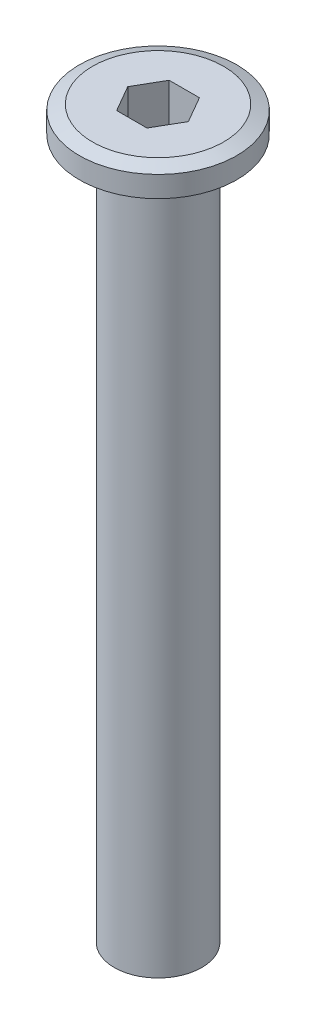
ISO-10303-21;
HEADER;
FILE_DESCRIPTION(('STEP AP214'),'2;1');
FILE_NAME('part.step','',(''),(''),'','','');
FILE_SCHEMA(('AUTOMOTIVE_DESIGN { 1 0 10303 214 1 1 1 1 }'));
ENDSEC;
DATA;
#1=APPLICATION_CONTEXT('core data for automotive mechanical design processes');
#2=APPLICATION_PROTOCOL_DEFINITION('international standard','automotive_design',2000,#1);
#3=PRODUCT_CONTEXT('',#1,'mechanical');
#4=PRODUCT('Part','Part','',(#3));
#5=PRODUCT_RELATED_PRODUCT_CATEGORY('part','',(#4));
#6=PRODUCT_DEFINITION_FORMATION('','',#4);
#7=PRODUCT_DEFINITION_CONTEXT('part definition',#1,'design');
#8=PRODUCT_DEFINITION('design','',#6,#7);
#9=PRODUCT_DEFINITION_SHAPE('','',#8);
#10=(LENGTH_UNIT() NAMED_UNIT(*) SI_UNIT(.MILLI.,.METRE.));
#11=(NAMED_UNIT(*) PLANE_ANGLE_UNIT() SI_UNIT($,.RADIAN.));
#12=(NAMED_UNIT(*) SI_UNIT($,.STERADIAN.) SOLID_ANGLE_UNIT());
#13=UNCERTAINTY_MEASURE_WITH_UNIT(LENGTH_MEASURE(1.E-05),#10,'distance_accuracy_value','');
#14=(GEOMETRIC_REPRESENTATION_CONTEXT(3) GLOBAL_UNCERTAINTY_ASSIGNED_CONTEXT((#13)) GLOBAL_UNIT_ASSIGNED_CONTEXT((#10,
#11,#12)) REPRESENTATION_CONTEXT('',''));
#15=CARTESIAN_POINT('',(0.,0.,0.));
#16=DIRECTION('',(0.,0.,1.));
#17=DIRECTION('',(1.,0.,0.));
#18=AXIS2_PLACEMENT_3D('',#15,#16,#17);
#19=CARTESIAN_POINT('',(0.,1.2,0.));
#20=DIRECTION('',(0.,-1.,0.));
#21=DIRECTION('',(0.,0.,-1.));
#22=AXIS2_PLACEMENT_3D('',#19,#20,#21);
#23=CONICAL_SURFACE('',#22,4.5,1.19028994968253);
#24=CARTESIAN_POINT('',(0.,1.5,0.));
#25=DIRECTION('',(0.,-1.,0.));
#26=DIRECTION('',(0.,0.,-1.));
#27=AXIS2_PLACEMENT_3D('',#24,#25,#26);
#28=CIRCLE('',#27,3.75);
#29=CARTESIAN_POINT('',(0.,1.5,-3.75));
#30=VERTEX_POINT('',#29);
#31=EDGE_CURVE('E146',#30,#30,#28,.T.);
#32=ORIENTED_EDGE('',*,*,#31,.T.);
#33=EDGE_LOOP('',(#32));
#34=FACE_BOUND('',#33,.T.);
#35=CARTESIAN_POINT('',(0.,1.2,0.));
#36=DIRECTION('',(0.,-1.,0.));
#37=DIRECTION('',(0.,0.,-1.));
#38=AXIS2_PLACEMENT_3D('',#35,#36,#37);
#39=CIRCLE('',#38,4.5);
#40=CARTESIAN_POINT('',(0.,1.2,-4.5));
#41=VERTEX_POINT('',#40);
#42=EDGE_CURVE('E44',#41,#41,#39,.T.);
#43=ORIENTED_EDGE('',*,*,#42,.F.);
#44=EDGE_LOOP('',(#43));
#45=FACE_BOUND('',#44,.T.);
#46=ADVANCED_FACE('F37',(#34,#45),#23,.T.);
#47=CARTESIAN_POINT('',(0.,0.,0.));
#48=DIRECTION('',(0.,-1.,0.));
#49=DIRECTION('',(0.,0.,-1.));
#50=AXIS2_PLACEMENT_3D('',#47,#48,#49);
#51=CYLINDRICAL_SURFACE('',#50,4.5);
#52=ORIENTED_EDGE('',*,*,#42,.T.);
#53=EDGE_LOOP('',(#52));
#54=FACE_BOUND('',#53,.T.);
#55=CARTESIAN_POINT('',(0.,0.,0.));
#56=DIRECTION('',(0.,-1.,0.));
#57=DIRECTION('',(0.,0.,-1.));
#58=AXIS2_PLACEMENT_3D('',#55,#56,#57);
#59=CIRCLE('',#58,4.5);
#60=CARTESIAN_POINT('',(0.,0.,-4.5));
#61=VERTEX_POINT('',#60);
#62=EDGE_CURVE('E149',#61,#61,#59,.T.);
#63=ORIENTED_EDGE('',*,*,#62,.F.);
#64=EDGE_LOOP('',(#63));
#65=FACE_BOUND('',#64,.T.);
#66=ADVANCED_FACE('F154',(#54,#65),#51,.T.);
#67=CARTESIAN_POINT('',(0.,0.,0.));
#68=DIRECTION('',(0.,1.,0.));
#69=DIRECTION('',(0.,0.,1.));
#70=AXIS2_PLACEMENT_3D('',#67,#68,#69);
#71=PLANE('',#70);
#72=CARTESIAN_POINT('',(0.,0.,0.));
#73=DIRECTION('',(0.,1.,0.));
#74=DIRECTION('',(0.,0.,1.));
#75=AXIS2_PLACEMENT_3D('',#72,#73,#74);
#76=CIRCLE('',#75,2.5);
#77=CARTESIAN_POINT('',(0.,0.,2.5));
#78=VERTEX_POINT('',#77);
#79=EDGE_CURVE('E11',#78,#78,#76,.F.);
#80=ORIENTED_EDGE('',*,*,#79,.F.);
#81=EDGE_LOOP('',(#80));
#82=FACE_BOUND('',#81,.T.);
#83=ORIENTED_EDGE('',*,*,#62,.T.);
#84=EDGE_LOOP('',(#83));
#85=FACE_BOUND('',#84,.T.);
#86=ADVANCED_FACE('F162',(#82,#85),#71,.F.);
#87=CARTESIAN_POINT('',(0.,1.5,0.));
#88=DIRECTION('',(0.,1.,0.));
#89=DIRECTION('',(0.,0.,1.));
#90=AXIS2_PLACEMENT_3D('',#87,#88,#89);
#91=PLANE('',#90);
#92=DIRECTION('',(0.5,0.,-0.866025403784439));
#93=VECTOR('',#92,1.);
#94=CARTESIAN_POINT('',(0.866025403784439,1.5,1.5));
#95=LINE('',#94,#93);
#96=CARTESIAN_POINT('',(0.866025403784439,1.5,1.5));
#97=VERTEX_POINT('',#96);
#98=CARTESIAN_POINT('',(1.73205080756888,1.5,0.));
#99=VERTEX_POINT('',#98);
#100=EDGE_CURVE('E51',#97,#99,#95,.T.);
#101=ORIENTED_EDGE('',*,*,#100,.F.);
#102=DIRECTION('',(1.,0.,0.));
#103=VECTOR('',#102,1.);
#104=CARTESIAN_POINT('',(-0.866025403784439,1.5,1.5));
#105=LINE('',#104,#103);
#106=CARTESIAN_POINT('',(-0.866025403784439,1.5,1.5));
#107=VERTEX_POINT('',#106);
#108=EDGE_CURVE('E134',#107,#97,#105,.T.);
#109=ORIENTED_EDGE('',*,*,#108,.F.);
#110=DIRECTION('',(0.5,0.,0.866025403784439));
#111=VECTOR('',#110,1.);
#112=CARTESIAN_POINT('',(-1.73205080756888,1.5,0.));
#113=LINE('',#112,#111);
#114=CARTESIAN_POINT('',(-1.73205080756888,1.5,0.));
#115=VERTEX_POINT('',#114);
#116=EDGE_CURVE('E132',#115,#107,#113,.T.);
#117=ORIENTED_EDGE('',*,*,#116,.F.);
#118=DIRECTION('',(-0.5,0.,0.866025403784439));
#119=VECTOR('',#118,1.);
#120=CARTESIAN_POINT('',(-0.866025403784439,1.5,-1.5));
#121=LINE('',#120,#119);
#122=CARTESIAN_POINT('',(-0.866025403784439,1.5,-1.5));
#123=VERTEX_POINT('',#122);
#124=EDGE_CURVE('E99',#123,#115,#121,.T.);
#125=ORIENTED_EDGE('',*,*,#124,.F.);
#126=DIRECTION('',(-1.,0.,0.));
#127=VECTOR('',#126,1.);
#128=CARTESIAN_POINT('',(0.866025403784439,1.5,-1.5));
#129=LINE('',#128,#127);
#130=CARTESIAN_POINT('',(0.866025403784439,1.5,-1.5));
#131=VERTEX_POINT('',#130);
#132=EDGE_CURVE('E128',#131,#123,#129,.T.);
#133=ORIENTED_EDGE('',*,*,#132,.F.);
#134=DIRECTION('',(-0.5,0.,-0.866025403784438));
#135=VECTOR('',#134,1.);
#136=CARTESIAN_POINT('',(1.73205080756888,1.5,0.));
#137=LINE('',#136,#135);
#138=EDGE_CURVE('E125',#99,#131,#137,.T.);
#139=ORIENTED_EDGE('',*,*,#138,.F.);
#140=EDGE_LOOP('',(#101,#109,#117,#125,#133,#139));
#141=FACE_BOUND('',#140,.T.);
#142=ORIENTED_EDGE('',*,*,#31,.F.);
#143=EDGE_LOOP('',(#142));
#144=FACE_BOUND('',#143,.T.);
#145=ADVANCED_FACE('F165',(#141,#144),#91,.T.);
#146=CARTESIAN_POINT('',(0.,-40.,0.));
#147=DIRECTION('',(0.,1.,0.));
#148=DIRECTION('',(0.,0.,1.));
#149=AXIS2_PLACEMENT_3D('',#146,#147,#148);
#150=CYLINDRICAL_SURFACE('',#149,2.5);
#151=CARTESIAN_POINT('',(0.,-40.,0.));
#152=DIRECTION('',(0.,-1.,0.));
#153=DIRECTION('',(0.,0.,-1.));
#154=AXIS2_PLACEMENT_3D('',#151,#152,#153);
#155=CIRCLE('',#154,2.5);
#156=CARTESIAN_POINT('',(0.,-40.,-2.5));
#157=VERTEX_POINT('',#156);
#158=EDGE_CURVE('E138',#157,#157,#155,.T.);
#159=ORIENTED_EDGE('',*,*,#158,.F.);
#160=EDGE_LOOP('',(#159));
#161=FACE_BOUND('',#160,.T.);
#162=ORIENTED_EDGE('',*,*,#79,.T.);
#163=EDGE_LOOP('',(#162));
#164=FACE_BOUND('',#163,.T.);
#165=ADVANCED_FACE('F167',(#161,#164),#150,.T.);
#166=CARTESIAN_POINT('',(0.,-40.,0.));
#167=DIRECTION('',(0.,-1.,0.));
#168=DIRECTION('',(0.,0.,-1.));
#169=AXIS2_PLACEMENT_3D('',#166,#167,#168);
#170=PLANE('',#169);
#171=ORIENTED_EDGE('',*,*,#158,.T.);
#172=EDGE_LOOP('',(#171));
#173=FACE_BOUND('',#172,.T.);
#174=ADVANCED_FACE('F174',(#173),#170,.T.);
#175=CARTESIAN_POINT('',(0.866025403784439,-1.5,1.5));
#176=DIRECTION('',(0.866025403784439,0.,0.5));
#177=DIRECTION('',(0.5,0.,-0.866025403784439));
#178=AXIS2_PLACEMENT_3D('',#175,#176,#177);
#179=PLANE('',#178);
#180=ORIENTED_EDGE('',*,*,#100,.T.);
#181=DIRECTION('',(0.,1.,0.));
#182=VECTOR('',#181,1.);
#183=CARTESIAN_POINT('',(1.73205080756888,-1.5,0.));
#184=LINE('',#183,#182);
#185=CARTESIAN_POINT('',(1.73205080756888,-1.5,0.));
#186=VERTEX_POINT('',#185);
#187=EDGE_CURVE('E81',#186,#99,#184,.T.);
#188=ORIENTED_EDGE('',*,*,#187,.F.);
#189=DIRECTION('',(0.5,0.,-0.866025403784439));
#190=VECTOR('',#189,1.);
#191=CARTESIAN_POINT('',(0.866025403784439,-1.5,1.5));
#192=LINE('',#191,#190);
#193=CARTESIAN_POINT('',(0.866025403784439,-1.5,1.5));
#194=VERTEX_POINT('',#193);
#195=EDGE_CURVE('E136',#194,#186,#192,.T.);
#196=ORIENTED_EDGE('',*,*,#195,.F.);
#197=DIRECTION('',(0.,1.,0.));
#198=VECTOR('',#197,1.);
#199=CARTESIAN_POINT('',(0.866025403784439,-1.5,1.5));
#200=LINE('',#199,#198);
#201=EDGE_CURVE('E59',#194,#97,#200,.T.);
#202=ORIENTED_EDGE('',*,*,#201,.T.);
#203=EDGE_LOOP('',(#180,#188,#196,#202));
#204=FACE_BOUND('',#203,.T.);
#205=ADVANCED_FACE('F182',(#204),#179,.F.);
#206=CARTESIAN_POINT('',(-0.866025403784439,-1.5,1.5));
#207=DIRECTION('',(0.,0.,1.));
#208=DIRECTION('',(1.,0.,0.));
#209=AXIS2_PLACEMENT_3D('',#206,#207,#208);
#210=PLANE('',#209);
#211=ORIENTED_EDGE('',*,*,#108,.T.);
#212=ORIENTED_EDGE('',*,*,#201,.F.);
#213=DIRECTION('',(1.,0.,0.));
#214=VECTOR('',#213,1.);
#215=CARTESIAN_POINT('',(-0.866025403784439,-1.5,1.5));
#216=LINE('',#215,#214);
#217=CARTESIAN_POINT('',(-0.866025403784439,-1.5,1.5));
#218=VERTEX_POINT('',#217);
#219=EDGE_CURVE('E111',#218,#194,#216,.T.);
#220=ORIENTED_EDGE('',*,*,#219,.F.);
#221=DIRECTION('',(0.,1.,0.));
#222=VECTOR('',#221,1.);
#223=CARTESIAN_POINT('',(-0.866025403784439,-1.5,1.5));
#224=LINE('',#223,#222);
#225=EDGE_CURVE('E103',#218,#107,#224,.T.);
#226=ORIENTED_EDGE('',*,*,#225,.T.);
#227=EDGE_LOOP('',(#211,#212,#220,#226));
#228=FACE_BOUND('',#227,.T.);
#229=ADVANCED_FACE('F186',(#228),#210,.F.);
#230=CARTESIAN_POINT('',(-1.73205080756888,-1.5,0.));
#231=DIRECTION('',(-0.866025403784439,0.,0.5));
#232=DIRECTION('',(0.5,0.,0.866025403784439));
#233=AXIS2_PLACEMENT_3D('',#230,#231,#232);
#234=PLANE('',#233);
#235=ORIENTED_EDGE('',*,*,#116,.T.);
#236=ORIENTED_EDGE('',*,*,#225,.F.);
#237=DIRECTION('',(0.5,0.,0.866025403784439));
#238=VECTOR('',#237,1.);
#239=CARTESIAN_POINT('',(-1.73205080756888,-1.5,0.));
#240=LINE('',#239,#238);
#241=CARTESIAN_POINT('',(-1.73205080756888,-1.5,0.));
#242=VERTEX_POINT('',#241);
#243=EDGE_CURVE('E107',#242,#218,#240,.T.);
#244=ORIENTED_EDGE('',*,*,#243,.F.);
#245=DIRECTION('',(0.,1.,0.));
#246=VECTOR('',#245,1.);
#247=CARTESIAN_POINT('',(-1.73205080756888,-1.5,0.));
#248=LINE('',#247,#246);
#249=EDGE_CURVE('E92',#242,#115,#248,.T.);
#250=ORIENTED_EDGE('',*,*,#249,.T.);
#251=EDGE_LOOP('',(#235,#236,#244,#250));
#252=FACE_BOUND('',#251,.T.);
#253=ADVANCED_FACE('F108',(#252),#234,.F.);
#254=CARTESIAN_POINT('',(-0.866025403784439,-1.5,-1.5));
#255=DIRECTION('',(-0.866025403784439,0.,-0.5));
#256=DIRECTION('',(-0.5,0.,0.866025403784439));
#257=AXIS2_PLACEMENT_3D('',#254,#255,#256);
#258=PLANE('',#257);
#259=ORIENTED_EDGE('',*,*,#124,.T.);
#260=ORIENTED_EDGE('',*,*,#249,.F.);
#261=DIRECTION('',(-0.5,0.,0.866025403784439));
#262=VECTOR('',#261,1.);
#263=CARTESIAN_POINT('',(-0.866025403784439,-1.5,-1.5));
#264=LINE('',#263,#262);
#265=CARTESIAN_POINT('',(-0.866025403784439,-1.5,-1.5));
#266=VERTEX_POINT('',#265);
#267=EDGE_CURVE('E96',#266,#242,#264,.T.);
#268=ORIENTED_EDGE('',*,*,#267,.F.);
#269=DIRECTION('',(0.,1.,0.));
#270=VECTOR('',#269,1.);
#271=CARTESIAN_POINT('',(-0.866025403784439,-1.5,-1.5));
#272=LINE('',#271,#270);
#273=EDGE_CURVE('E104',#266,#123,#272,.T.);
#274=ORIENTED_EDGE('',*,*,#273,.T.);
#275=EDGE_LOOP('',(#259,#260,#268,#274));
#276=FACE_BOUND('',#275,.T.);
#277=ADVANCED_FACE('F94',(#276),#258,.F.);
#278=CARTESIAN_POINT('',(0.866025403784439,-1.5,-1.5));
#279=DIRECTION('',(0.,0.,-1.));
#280=DIRECTION('',(-1.,0.,0.));
#281=AXIS2_PLACEMENT_3D('',#278,#279,#280);
#282=PLANE('',#281);
#283=ORIENTED_EDGE('',*,*,#132,.T.);
#284=ORIENTED_EDGE('',*,*,#273,.F.);
#285=DIRECTION('',(-1.,0.,0.));
#286=VECTOR('',#285,1.);
#287=CARTESIAN_POINT('',(0.866025403784439,-1.5,-1.5));
#288=LINE('',#287,#286);
#289=CARTESIAN_POINT('',(0.866025403784439,-1.5,-1.5));
#290=VERTEX_POINT('',#289);
#291=EDGE_CURVE('E117',#290,#266,#288,.T.);
#292=ORIENTED_EDGE('',*,*,#291,.F.);
#293=DIRECTION('',(0.,1.,0.));
#294=VECTOR('',#293,1.);
#295=CARTESIAN_POINT('',(0.866025403784439,-1.5,-1.5));
#296=LINE('',#295,#294);
#297=EDGE_CURVE('E141',#290,#131,#296,.T.);
#298=ORIENTED_EDGE('',*,*,#297,.T.);
#299=EDGE_LOOP('',(#283,#284,#292,#298));
#300=FACE_BOUND('',#299,.T.);
#301=ADVANCED_FACE('F190',(#300),#282,.F.);
#302=CARTESIAN_POINT('',(1.73205080756888,-1.5,0.));
#303=DIRECTION('',(0.866025403784439,0.,-0.5));
#304=DIRECTION('',(-0.5,0.,-0.866025403784439));
#305=AXIS2_PLACEMENT_3D('',#302,#303,#304);
#306=PLANE('',#305);
#307=ORIENTED_EDGE('',*,*,#138,.T.);
#308=ORIENTED_EDGE('',*,*,#297,.F.);
#309=DIRECTION('',(-0.5,0.,-0.866025403784438));
#310=VECTOR('',#309,1.);
#311=CARTESIAN_POINT('',(1.73205080756888,-1.5,0.));
#312=LINE('',#311,#310);
#313=EDGE_CURVE('E119',#186,#290,#312,.T.);
#314=ORIENTED_EDGE('',*,*,#313,.F.);
#315=ORIENTED_EDGE('',*,*,#187,.T.);
#316=EDGE_LOOP('',(#307,#308,#314,#315));
#317=FACE_BOUND('',#316,.T.);
#318=ADVANCED_FACE('F187',(#317),#306,.F.);
#319=CARTESIAN_POINT('',(0.,-1.5,0.));
#320=DIRECTION('',(0.,1.,0.));
#321=DIRECTION('',(0.,0.,1.));
#322=AXIS2_PLACEMENT_3D('',#319,#320,#321);
#323=PLANE('',#322);
#324=ORIENTED_EDGE('',*,*,#195,.T.);
#325=ORIENTED_EDGE('',*,*,#313,.T.);
#326=ORIENTED_EDGE('',*,*,#291,.T.);
#327=ORIENTED_EDGE('',*,*,#267,.T.);
#328=ORIENTED_EDGE('',*,*,#243,.T.);
#329=ORIENTED_EDGE('',*,*,#219,.T.);
#330=EDGE_LOOP('',(#324,#325,#326,#327,#328,#329));
#331=FACE_BOUND('',#330,.T.);
#332=ADVANCED_FACE('F114',(#331),#323,.T.);
#333=CLOSED_SHELL('',(#46,#66,#86,#145,#165,#174,#205,#229,#253,#277,#301,#318,#332));
#334=MANIFOLD_SOLID_BREP('B2',#333);
#335=ADVANCED_BREP_SHAPE_REPRESENTATION('',(#18,#334),#14);
#336=SHAPE_DEFINITION_REPRESENTATION(#9,#335);
ENDSEC;
END-ISO-10303-21;
